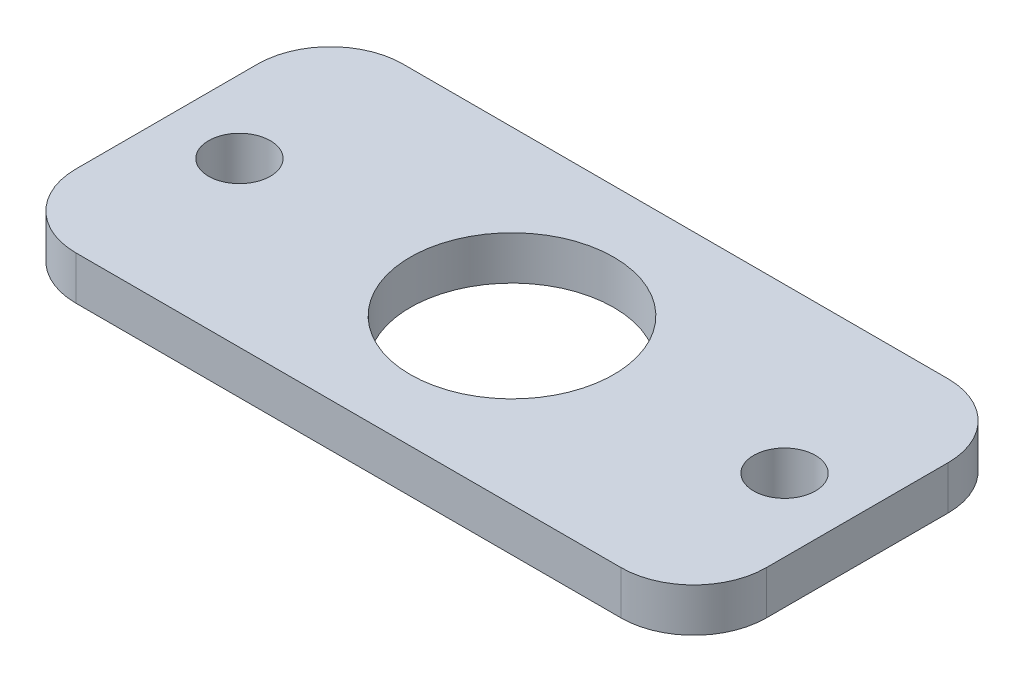
ISO-10303-21;
HEADER;
FILE_DESCRIPTION(('STEP AP214'),'2;1');
FILE_NAME('part.step','',(''),(''),'','','');
FILE_SCHEMA(('AUTOMOTIVE_DESIGN { 1 0 10303 214 1 1 1 1 }'));
ENDSEC;
DATA;
#1=APPLICATION_CONTEXT('core data for automotive mechanical design processes');
#2=APPLICATION_PROTOCOL_DEFINITION('international standard','automotive_design',2000,#1);
#3=PRODUCT_CONTEXT('',#1,'mechanical');
#4=PRODUCT('Part','Part','',(#3));
#5=PRODUCT_RELATED_PRODUCT_CATEGORY('part','',(#4));
#6=PRODUCT_DEFINITION_FORMATION('','',#4);
#7=PRODUCT_DEFINITION_CONTEXT('part definition',#1,'design');
#8=PRODUCT_DEFINITION('design','',#6,#7);
#9=PRODUCT_DEFINITION_SHAPE('','',#8);
#10=(LENGTH_UNIT() NAMED_UNIT(*) SI_UNIT(.MILLI.,.METRE.));
#11=(NAMED_UNIT(*) PLANE_ANGLE_UNIT() SI_UNIT($,.RADIAN.));
#12=(NAMED_UNIT(*) SI_UNIT($,.STERADIAN.) SOLID_ANGLE_UNIT());
#13=UNCERTAINTY_MEASURE_WITH_UNIT(LENGTH_MEASURE(1.E-05),#10,'distance_accuracy_value','');
#14=(GEOMETRIC_REPRESENTATION_CONTEXT(3) GLOBAL_UNCERTAINTY_ASSIGNED_CONTEXT((#13)) GLOBAL_UNIT_ASSIGNED_CONTEXT((#10,
#11,#12)) REPRESENTATION_CONTEXT('',''));
#15=CARTESIAN_POINT('',(0.,0.,0.));
#16=DIRECTION('',(0.,0.,1.));
#17=DIRECTION('',(1.,0.,0.));
#18=AXIS2_PLACEMENT_3D('',#15,#16,#17);
#19=CARTESIAN_POINT('',(0.,6.,0.));
#20=DIRECTION('',(0.,-1.,0.));
#21=DIRECTION('',(0.,0.,-1.));
#22=AXIS2_PLACEMENT_3D('',#19,#20,#21);
#23=PLANE('',#22);
#24=DIRECTION('',(-1.,0.,0.));
#25=VECTOR('',#24,1.);
#26=CARTESIAN_POINT('',(-47.5,6.,-22.5));
#27=LINE('',#26,#25);
#28=CARTESIAN_POINT('',(37.5,6.,-22.5));
#29=VERTEX_POINT('',#28);
#30=CARTESIAN_POINT('',(-37.5,6.,-22.5));
#31=VERTEX_POINT('',#30);
#32=EDGE_CURVE('E169',#29,#31,#27,.T.);
#33=ORIENTED_EDGE('',*,*,#32,.T.);
#34=CARTESIAN_POINT('',(-37.5,6.,-12.5));
#35=DIRECTION('',(0.,-1.,0.));
#36=DIRECTION('',(0.,0.,-1.));
#37=AXIS2_PLACEMENT_3D('',#34,#35,#36);
#38=CIRCLE('',#37,10.);
#39=CARTESIAN_POINT('',(-47.5,6.,-12.5));
#40=VERTEX_POINT('',#39);
#41=EDGE_CURVE('E147',#31,#40,#38,.F.);
#42=ORIENTED_EDGE('',*,*,#41,.T.);
#43=DIRECTION('',(0.,0.,1.));
#44=VECTOR('',#43,1.);
#45=CARTESIAN_POINT('',(-47.5,6.,22.5));
#46=LINE('',#45,#44);
#47=CARTESIAN_POINT('',(-47.5,6.,12.5));
#48=VERTEX_POINT('',#47);
#49=EDGE_CURVE('E117',#40,#48,#46,.T.);
#50=ORIENTED_EDGE('',*,*,#49,.T.);
#51=CARTESIAN_POINT('',(-37.5,6.,12.5));
#52=DIRECTION('',(0.,-1.,0.));
#53=DIRECTION('',(0.,0.,-1.));
#54=AXIS2_PLACEMENT_3D('',#51,#52,#53);
#55=CIRCLE('',#54,10.);
#56=CARTESIAN_POINT('',(-37.5,6.,22.5));
#57=VERTEX_POINT('',#56);
#58=EDGE_CURVE('E53',#48,#57,#55,.F.);
#59=ORIENTED_EDGE('',*,*,#58,.T.);
#60=DIRECTION('',(1.,0.,0.));
#61=VECTOR('',#60,1.);
#62=CARTESIAN_POINT('',(-47.5,6.,22.5));
#63=LINE('',#62,#61);
#64=CARTESIAN_POINT('',(37.5,6.,22.5));
#65=VERTEX_POINT('',#64);
#66=EDGE_CURVE('E133',#57,#65,#63,.T.);
#67=ORIENTED_EDGE('',*,*,#66,.T.);
#68=CARTESIAN_POINT('',(37.5,6.,12.5));
#69=DIRECTION('',(0.,-1.,0.));
#70=DIRECTION('',(0.,0.,-1.));
#71=AXIS2_PLACEMENT_3D('',#68,#69,#70);
#72=CIRCLE('',#71,10.);
#73=CARTESIAN_POINT('',(47.5,6.,12.5));
#74=VERTEX_POINT('',#73);
#75=EDGE_CURVE('E143',#65,#74,#72,.F.);
#76=ORIENTED_EDGE('',*,*,#75,.T.);
#77=DIRECTION('',(0.,0.,-1.));
#78=VECTOR('',#77,1.);
#79=CARTESIAN_POINT('',(47.5,6.,22.5));
#80=LINE('',#79,#78);
#81=CARTESIAN_POINT('',(47.5,6.,-12.5));
#82=VERTEX_POINT('',#81);
#83=EDGE_CURVE('E127',#74,#82,#80,.T.);
#84=ORIENTED_EDGE('',*,*,#83,.T.);
#85=CARTESIAN_POINT('',(37.5,6.,-12.5));
#86=DIRECTION('',(0.,-1.,0.));
#87=DIRECTION('',(0.,0.,-1.));
#88=AXIS2_PLACEMENT_3D('',#85,#86,#87);
#89=CIRCLE('',#88,10.);
#90=EDGE_CURVE('E145',#82,#29,#89,.F.);
#91=ORIENTED_EDGE('',*,*,#90,.T.);
#92=EDGE_LOOP('',(#33,#42,#50,#59,#67,#76,#84,#91));
#93=FACE_BOUND('',#92,.T.);
#94=CARTESIAN_POINT('',(0.,6.,0.));
#95=DIRECTION('',(0.,1.,0.));
#96=DIRECTION('',(0.,0.,1.));
#97=AXIS2_PLACEMENT_3D('',#94,#95,#96);
#98=CIRCLE('',#97,14.);
#99=CARTESIAN_POINT('',(0.,6.,14.));
#100=VERTEX_POINT('',#99);
#101=EDGE_CURVE('E178',#100,#100,#98,.T.);
#102=ORIENTED_EDGE('',*,*,#101,.F.);
#103=EDGE_LOOP('',(#102));
#104=FACE_BOUND('',#103,.T.);
#105=CARTESIAN_POINT('',(37.5,6.,0.));
#106=DIRECTION('',(0.,1.,0.));
#107=DIRECTION('',(0.,0.,1.));
#108=AXIS2_PLACEMENT_3D('',#105,#106,#107);
#109=CIRCLE('',#108,4.25000000000001);
#110=CARTESIAN_POINT('',(37.5,6.,4.25));
#111=VERTEX_POINT('',#110);
#112=EDGE_CURVE('E183',#111,#111,#109,.T.);
#113=ORIENTED_EDGE('',*,*,#112,.F.);
#114=EDGE_LOOP('',(#113));
#115=FACE_BOUND('',#114,.T.);
#116=CARTESIAN_POINT('',(-37.5,6.,0.));
#117=DIRECTION('',(0.,1.,0.));
#118=DIRECTION('',(0.,0.,-1.));
#119=AXIS2_PLACEMENT_3D('',#116,#117,#118);
#120=CIRCLE('',#119,4.25000000000001);
#121=CARTESIAN_POINT('',(-37.5,6.,-4.25000000000001));
#122=VERTEX_POINT('',#121);
#123=EDGE_CURVE('E188',#122,#122,#120,.T.);
#124=ORIENTED_EDGE('',*,*,#123,.F.);
#125=EDGE_LOOP('',(#124));
#126=FACE_BOUND('',#125,.T.);
#127=ADVANCED_FACE('F33',(#93,#104,#115,#126),#23,.F.);
#128=CARTESIAN_POINT('',(0.,0.,0.));
#129=DIRECTION('',(0.,-1.,0.));
#130=DIRECTION('',(0.,0.,-1.));
#131=AXIS2_PLACEMENT_3D('',#128,#129,#130);
#132=PLANE('',#131);
#133=CARTESIAN_POINT('',(37.5,0.,0.));
#134=DIRECTION('',(0.,1.,0.));
#135=DIRECTION('',(0.,0.,1.));
#136=AXIS2_PLACEMENT_3D('',#133,#134,#135);
#137=CIRCLE('',#136,4.25000000000001);
#138=CARTESIAN_POINT('',(37.5,0.,4.25));
#139=VERTEX_POINT('',#138);
#140=EDGE_CURVE('E185',#139,#139,#137,.T.);
#141=ORIENTED_EDGE('',*,*,#140,.T.);
#142=EDGE_LOOP('',(#141));
#143=FACE_BOUND('',#142,.T.);
#144=DIRECTION('',(0.,0.,1.));
#145=VECTOR('',#144,1.);
#146=CARTESIAN_POINT('',(-47.5,0.,22.5));
#147=LINE('',#146,#145);
#148=CARTESIAN_POINT('',(-47.5,0.,-12.5));
#149=VERTEX_POINT('',#148);
#150=CARTESIAN_POINT('',(-47.5,0.,12.5));
#151=VERTEX_POINT('',#150);
#152=EDGE_CURVE('E115',#149,#151,#147,.T.);
#153=ORIENTED_EDGE('',*,*,#152,.F.);
#154=CARTESIAN_POINT('',(-37.5,0.,-12.5));
#155=DIRECTION('',(0.,-1.,0.));
#156=DIRECTION('',(0.,0.,-1.));
#157=AXIS2_PLACEMENT_3D('',#154,#155,#156);
#158=CIRCLE('',#157,10.);
#159=CARTESIAN_POINT('',(-37.5,0.,-22.5));
#160=VERTEX_POINT('',#159);
#161=EDGE_CURVE('E98',#149,#160,#158,.T.);
#162=ORIENTED_EDGE('',*,*,#161,.T.);
#163=DIRECTION('',(-1.,0.,0.));
#164=VECTOR('',#163,1.);
#165=CARTESIAN_POINT('',(-47.5,0.,-22.5));
#166=LINE('',#165,#164);
#167=CARTESIAN_POINT('',(37.5,0.,-22.5));
#168=VERTEX_POINT('',#167);
#169=EDGE_CURVE('E125',#168,#160,#166,.T.);
#170=ORIENTED_EDGE('',*,*,#169,.F.);
#171=CARTESIAN_POINT('',(37.5,0.,-12.5));
#172=DIRECTION('',(0.,-1.,0.));
#173=DIRECTION('',(0.,0.,-1.));
#174=AXIS2_PLACEMENT_3D('',#171,#172,#173);
#175=CIRCLE('',#174,10.);
#176=CARTESIAN_POINT('',(47.5,0.,-12.5));
#177=VERTEX_POINT('',#176);
#178=EDGE_CURVE('E109',#168,#177,#175,.T.);
#179=ORIENTED_EDGE('',*,*,#178,.T.);
#180=DIRECTION('',(0.,0.,-1.));
#181=VECTOR('',#180,1.);
#182=CARTESIAN_POINT('',(47.5,0.,22.5));
#183=LINE('',#182,#181);
#184=CARTESIAN_POINT('',(47.5,0.,12.5));
#185=VERTEX_POINT('',#184);
#186=EDGE_CURVE('E129',#185,#177,#183,.T.);
#187=ORIENTED_EDGE('',*,*,#186,.F.);
#188=CARTESIAN_POINT('',(37.5,0.,12.5));
#189=DIRECTION('',(0.,-1.,0.));
#190=DIRECTION('',(0.,0.,-1.));
#191=AXIS2_PLACEMENT_3D('',#188,#189,#190);
#192=CIRCLE('',#191,10.);
#193=CARTESIAN_POINT('',(37.5,0.,22.5));
#194=VERTEX_POINT('',#193);
#195=EDGE_CURVE('E136',#185,#194,#192,.T.);
#196=ORIENTED_EDGE('',*,*,#195,.T.);
#197=DIRECTION('',(1.,0.,0.));
#198=VECTOR('',#197,1.);
#199=CARTESIAN_POINT('',(-47.5,0.,22.5));
#200=LINE('',#199,#198);
#201=CARTESIAN_POINT('',(-37.5,0.,22.5));
#202=VERTEX_POINT('',#201);
#203=EDGE_CURVE('E124',#202,#194,#200,.T.);
#204=ORIENTED_EDGE('',*,*,#203,.F.);
#205=CARTESIAN_POINT('',(-37.5,0.,12.5));
#206=DIRECTION('',(0.,-1.,0.));
#207=DIRECTION('',(0.,0.,-1.));
#208=AXIS2_PLACEMENT_3D('',#205,#206,#207);
#209=CIRCLE('',#208,10.);
#210=EDGE_CURVE('E118',#202,#151,#209,.T.);
#211=ORIENTED_EDGE('',*,*,#210,.T.);
#212=EDGE_LOOP('',(#153,#162,#170,#179,#187,#196,#204,#211));
#213=FACE_BOUND('',#212,.T.);
#214=CARTESIAN_POINT('',(0.,0.,0.));
#215=DIRECTION('',(0.,1.,0.));
#216=DIRECTION('',(0.,0.,1.));
#217=AXIS2_PLACEMENT_3D('',#214,#215,#216);
#218=CIRCLE('',#217,14.);
#219=CARTESIAN_POINT('',(0.,0.,14.));
#220=VERTEX_POINT('',#219);
#221=EDGE_CURVE('E174',#220,#220,#218,.T.);
#222=ORIENTED_EDGE('',*,*,#221,.T.);
#223=EDGE_LOOP('',(#222));
#224=FACE_BOUND('',#223,.T.);
#225=CARTESIAN_POINT('',(-37.5,0.,0.));
#226=DIRECTION('',(0.,1.,0.));
#227=DIRECTION('',(0.,0.,-1.));
#228=AXIS2_PLACEMENT_3D('',#225,#226,#227);
#229=CIRCLE('',#228,4.25000000000001);
#230=CARTESIAN_POINT('',(-37.5,0.,-4.25000000000001));
#231=VERTEX_POINT('',#230);
#232=EDGE_CURVE('E191',#231,#231,#229,.T.);
#233=ORIENTED_EDGE('',*,*,#232,.T.);
#234=EDGE_LOOP('',(#233));
#235=FACE_BOUND('',#234,.T.);
#236=ADVANCED_FACE('F121',(#143,#213,#224,#235),#132,.T.);
#237=CARTESIAN_POINT('',(47.5,6.,22.5));
#238=DIRECTION('',(-1.,0.,0.));
#239=DIRECTION('',(0.,0.,1.));
#240=AXIS2_PLACEMENT_3D('',#237,#238,#239);
#241=PLANE('',#240);
#242=ORIENTED_EDGE('',*,*,#186,.T.);
#243=DIRECTION('',(0.,-1.,0.));
#244=VECTOR('',#243,1.);
#245=CARTESIAN_POINT('',(47.5,6.,-12.5));
#246=LINE('',#245,#244);
#247=EDGE_CURVE('E152',#177,#82,#246,.F.);
#248=ORIENTED_EDGE('',*,*,#247,.T.);
#249=ORIENTED_EDGE('',*,*,#83,.F.);
#250=DIRECTION('',(0.,-1.,0.));
#251=VECTOR('',#250,1.);
#252=CARTESIAN_POINT('',(47.5,6.,12.5));
#253=LINE('',#252,#251);
#254=EDGE_CURVE('E149',#74,#185,#253,.T.);
#255=ORIENTED_EDGE('',*,*,#254,.T.);
#256=EDGE_LOOP('',(#242,#248,#249,#255));
#257=FACE_BOUND('',#256,.T.);
#258=ADVANCED_FACE('F165',(#257),#241,.F.);
#259=CARTESIAN_POINT('',(-47.5,6.,-22.5));
#260=DIRECTION('',(0.,0.,1.));
#261=DIRECTION('',(1.,0.,0.));
#262=AXIS2_PLACEMENT_3D('',#259,#260,#261);
#263=PLANE('',#262);
#264=ORIENTED_EDGE('',*,*,#169,.T.);
#265=DIRECTION('',(0.,-1.,0.));
#266=VECTOR('',#265,1.);
#267=CARTESIAN_POINT('',(-37.5,6.,-22.5));
#268=LINE('',#267,#266);
#269=EDGE_CURVE('E103',#160,#31,#268,.F.);
#270=ORIENTED_EDGE('',*,*,#269,.T.);
#271=ORIENTED_EDGE('',*,*,#32,.F.);
#272=DIRECTION('',(0.,-1.,0.));
#273=VECTOR('',#272,1.);
#274=CARTESIAN_POINT('',(37.5,6.,-22.5));
#275=LINE('',#274,#273);
#276=EDGE_CURVE('E108',#29,#168,#275,.T.);
#277=ORIENTED_EDGE('',*,*,#276,.T.);
#278=EDGE_LOOP('',(#264,#270,#271,#277));
#279=FACE_BOUND('',#278,.T.);
#280=ADVANCED_FACE('F216',(#279),#263,.F.);
#281=CARTESIAN_POINT('',(-47.5,6.,22.5));
#282=DIRECTION('',(1.,0.,0.));
#283=DIRECTION('',(0.,0.,-1.));
#284=AXIS2_PLACEMENT_3D('',#281,#282,#283);
#285=PLANE('',#284);
#286=ORIENTED_EDGE('',*,*,#49,.F.);
#287=DIRECTION('',(0.,-1.,0.));
#288=VECTOR('',#287,1.);
#289=CARTESIAN_POINT('',(-47.5,6.,-12.5));
#290=LINE('',#289,#288);
#291=EDGE_CURVE('E102',#40,#149,#290,.T.);
#292=ORIENTED_EDGE('',*,*,#291,.T.);
#293=ORIENTED_EDGE('',*,*,#152,.T.);
#294=DIRECTION('',(0.,-1.,0.));
#295=VECTOR('',#294,1.);
#296=CARTESIAN_POINT('',(-47.5,6.,12.5));
#297=LINE('',#296,#295);
#298=EDGE_CURVE('E119',#151,#48,#297,.F.);
#299=ORIENTED_EDGE('',*,*,#298,.T.);
#300=EDGE_LOOP('',(#286,#292,#293,#299));
#301=FACE_BOUND('',#300,.T.);
#302=ADVANCED_FACE('F114',(#301),#285,.F.);
#303=CARTESIAN_POINT('',(-47.5,6.,22.5));
#304=DIRECTION('',(0.,0.,-1.));
#305=DIRECTION('',(-1.,0.,0.));
#306=AXIS2_PLACEMENT_3D('',#303,#304,#305);
#307=PLANE('',#306);
#308=ORIENTED_EDGE('',*,*,#203,.T.);
#309=DIRECTION('',(0.,-1.,0.));
#310=VECTOR('',#309,1.);
#311=CARTESIAN_POINT('',(37.5,6.,22.5));
#312=LINE('',#311,#310);
#313=EDGE_CURVE('E11',#194,#65,#312,.F.);
#314=ORIENTED_EDGE('',*,*,#313,.T.);
#315=ORIENTED_EDGE('',*,*,#66,.F.);
#316=DIRECTION('',(0.,-1.,0.));
#317=VECTOR('',#316,1.);
#318=CARTESIAN_POINT('',(-37.5,6.,22.5));
#319=LINE('',#318,#317);
#320=EDGE_CURVE('E41',#57,#202,#319,.T.);
#321=ORIENTED_EDGE('',*,*,#320,.T.);
#322=EDGE_LOOP('',(#308,#314,#315,#321));
#323=FACE_BOUND('',#322,.T.);
#324=ADVANCED_FACE('F155',(#323),#307,.F.);
#325=CARTESIAN_POINT('',(0.,6.,0.));
#326=DIRECTION('',(0.,-1.,0.));
#327=DIRECTION('',(0.,0.,-1.));
#328=AXIS2_PLACEMENT_3D('',#325,#326,#327);
#329=CYLINDRICAL_SURFACE('',#328,14.);
#330=ORIENTED_EDGE('',*,*,#101,.T.);
#331=EDGE_LOOP('',(#330));
#332=FACE_BOUND('',#331,.T.);
#333=ORIENTED_EDGE('',*,*,#221,.F.);
#334=EDGE_LOOP('',(#333));
#335=FACE_BOUND('',#334,.T.);
#336=ADVANCED_FACE('F209',(#332,#335),#329,.F.);
#337=CARTESIAN_POINT('',(37.5,6.,0.));
#338=DIRECTION('',(0.,-1.,0.));
#339=DIRECTION('',(0.,0.,-1.));
#340=AXIS2_PLACEMENT_3D('',#337,#338,#339);
#341=CYLINDRICAL_SURFACE('',#340,4.25000000000001);
#342=ORIENTED_EDGE('',*,*,#112,.T.);
#343=EDGE_LOOP('',(#342));
#344=FACE_BOUND('',#343,.T.);
#345=ORIENTED_EDGE('',*,*,#140,.F.);
#346=EDGE_LOOP('',(#345));
#347=FACE_BOUND('',#346,.T.);
#348=ADVANCED_FACE('F296',(#344,#347),#341,.F.);
#349=CARTESIAN_POINT('',(-37.5,6.,0.));
#350=DIRECTION('',(0.,-1.,0.));
#351=DIRECTION('',(0.,0.,-1.));
#352=AXIS2_PLACEMENT_3D('',#349,#350,#351);
#353=CYLINDRICAL_SURFACE('',#352,4.25000000000001);
#354=ORIENTED_EDGE('',*,*,#123,.T.);
#355=EDGE_LOOP('',(#354));
#356=FACE_BOUND('',#355,.T.);
#357=ORIENTED_EDGE('',*,*,#232,.F.);
#358=EDGE_LOOP('',(#357));
#359=FACE_BOUND('',#358,.T.);
#360=ADVANCED_FACE('F197',(#356,#359),#353,.F.);
#361=CARTESIAN_POINT('',(-37.5,6.,-12.5));
#362=DIRECTION('',(0.,-1.,0.));
#363=DIRECTION('',(0.,0.,-1.));
#364=AXIS2_PLACEMENT_3D('',#361,#362,#363);
#365=CYLINDRICAL_SURFACE('',#364,10.);
#366=ORIENTED_EDGE('',*,*,#41,.F.);
#367=ORIENTED_EDGE('',*,*,#269,.F.);
#368=ORIENTED_EDGE('',*,*,#161,.F.);
#369=ORIENTED_EDGE('',*,*,#291,.F.);
#370=EDGE_LOOP('',(#366,#367,#368,#369));
#371=FACE_BOUND('',#370,.T.);
#372=ADVANCED_FACE('F101',(#371),#365,.T.);
#373=CARTESIAN_POINT('',(37.5,6.,-12.5));
#374=DIRECTION('',(0.,-1.,0.));
#375=DIRECTION('',(0.,0.,-1.));
#376=AXIS2_PLACEMENT_3D('',#373,#374,#375);
#377=CYLINDRICAL_SURFACE('',#376,10.);
#378=ORIENTED_EDGE('',*,*,#90,.F.);
#379=ORIENTED_EDGE('',*,*,#247,.F.);
#380=ORIENTED_EDGE('',*,*,#178,.F.);
#381=ORIENTED_EDGE('',*,*,#276,.F.);
#382=EDGE_LOOP('',(#378,#379,#380,#381));
#383=FACE_BOUND('',#382,.T.);
#384=ADVANCED_FACE('F224',(#383),#377,.T.);
#385=CARTESIAN_POINT('',(37.5,6.,12.5));
#386=DIRECTION('',(0.,-1.,0.));
#387=DIRECTION('',(0.,0.,-1.));
#388=AXIS2_PLACEMENT_3D('',#385,#386,#387);
#389=CYLINDRICAL_SURFACE('',#388,10.);
#390=ORIENTED_EDGE('',*,*,#75,.F.);
#391=ORIENTED_EDGE('',*,*,#313,.F.);
#392=ORIENTED_EDGE('',*,*,#195,.F.);
#393=ORIENTED_EDGE('',*,*,#254,.F.);
#394=EDGE_LOOP('',(#390,#391,#392,#393));
#395=FACE_BOUND('',#394,.T.);
#396=ADVANCED_FACE('F162',(#395),#389,.T.);
#397=CARTESIAN_POINT('',(-37.5,6.,12.5));
#398=DIRECTION('',(0.,-1.,0.));
#399=DIRECTION('',(0.,0.,-1.));
#400=AXIS2_PLACEMENT_3D('',#397,#398,#399);
#401=CYLINDRICAL_SURFACE('',#400,10.);
#402=ORIENTED_EDGE('',*,*,#58,.F.);
#403=ORIENTED_EDGE('',*,*,#298,.F.);
#404=ORIENTED_EDGE('',*,*,#210,.F.);
#405=ORIENTED_EDGE('',*,*,#320,.F.);
#406=EDGE_LOOP('',(#402,#403,#404,#405));
#407=FACE_BOUND('',#406,.T.);
#408=ADVANCED_FACE('F35',(#407),#401,.T.);
#409=CLOSED_SHELL('',(#127,#236,#258,#280,#302,#324,#336,#348,#360,#372,#384,#396,#408));
#410=MANIFOLD_SOLID_BREP('B2',#409);
#411=ADVANCED_BREP_SHAPE_REPRESENTATION('',(#18,#410),#14);
#412=SHAPE_DEFINITION_REPRESENTATION(#9,#411);
ENDSEC;
END-ISO-10303-21;
